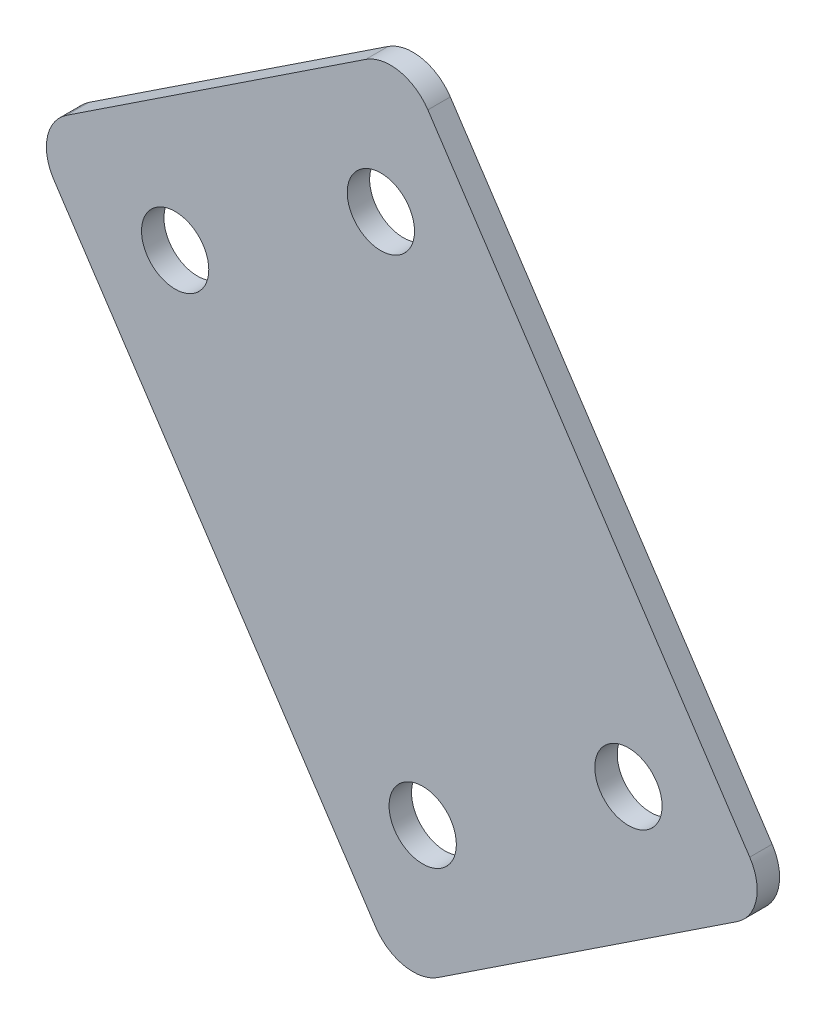
ISO-10303-21;
HEADER;
FILE_DESCRIPTION(('STEP AP214'),'2;1');
FILE_NAME('part.step','',(''),(''),'','','');
FILE_SCHEMA(('AUTOMOTIVE_DESIGN { 1 0 10303 214 1 1 1 1 }'));
ENDSEC;
DATA;
#1=APPLICATION_CONTEXT('core data for automotive mechanical design processes');
#2=APPLICATION_PROTOCOL_DEFINITION('international standard','automotive_design',2000,#1);
#3=PRODUCT_CONTEXT('',#1,'mechanical');
#4=PRODUCT('Part','Part','',(#3));
#5=PRODUCT_RELATED_PRODUCT_CATEGORY('part','',(#4));
#6=PRODUCT_DEFINITION_FORMATION('','',#4);
#7=PRODUCT_DEFINITION_CONTEXT('part definition',#1,'design');
#8=PRODUCT_DEFINITION('design','',#6,#7);
#9=PRODUCT_DEFINITION_SHAPE('','',#8);
#10=(LENGTH_UNIT() NAMED_UNIT(*) SI_UNIT(.MILLI.,.METRE.));
#11=(NAMED_UNIT(*) PLANE_ANGLE_UNIT() SI_UNIT($,.RADIAN.));
#12=(NAMED_UNIT(*) SI_UNIT($,.STERADIAN.) SOLID_ANGLE_UNIT());
#13=UNCERTAINTY_MEASURE_WITH_UNIT(LENGTH_MEASURE(1.E-05),#10,'distance_accuracy_value','');
#14=(GEOMETRIC_REPRESENTATION_CONTEXT(3) GLOBAL_UNCERTAINTY_ASSIGNED_CONTEXT((#13)) GLOBAL_UNIT_ASSIGNED_CONTEXT((#10,
#11,#12)) REPRESENTATION_CONTEXT('',''));
#15=CARTESIAN_POINT('',(0.,0.,0.));
#16=DIRECTION('',(0.,0.,1.));
#17=DIRECTION('',(1.,0.,0.));
#18=AXIS2_PLACEMENT_3D('',#15,#16,#17);
#19=CARTESIAN_POINT('',(13.8462673855963,-6.42501980437193,1.));
#20=DIRECTION('',(0.,0.,1.));
#21=DIRECTION('',(1.,0.,0.));
#22=AXIS2_PLACEMENT_3D('',#19,#20,#21);
#23=PLANE('',#22);
#24=CARTESIAN_POINT('',(-10.1057418744918,5.30320480145186,1.));
#25=DIRECTION('',(0.,0.,1.));
#26=DIRECTION('',(1.,0.,0.));
#27=AXIS2_PLACEMENT_3D('',#24,#25,#26);
#28=CIRCLE('',#27,1.50000000000001);
#29=CARTESIAN_POINT('',(-8.60574187449182,5.30320480145186,1.));
#30=VERTEX_POINT('',#29);
#31=EDGE_CURVE('E196',#30,#30,#28,.T.);
#32=ORIENTED_EDGE('',*,*,#31,.F.);
#33=EDGE_LOOP('',(#32));
#34=FACE_BOUND('',#33,.T.);
#35=CARTESIAN_POINT('',(10.1057418744918,-5.30320480145186,1.));
#36=DIRECTION('',(0.,0.,1.));
#37=DIRECTION('',(1.,0.,0.));
#38=AXIS2_PLACEMENT_3D('',#35,#36,#37);
#39=CIRCLE('',#38,1.50000000000001);
#40=CARTESIAN_POINT('',(11.6057418744918,-5.30320480145186,1.));
#41=VERTEX_POINT('',#40);
#42=EDGE_CURVE('E142',#41,#41,#39,.T.);
#43=ORIENTED_EDGE('',*,*,#42,.F.);
#44=EDGE_LOOP('',(#43));
#45=FACE_BOUND('',#44,.T.);
#46=CARTESIAN_POINT('',(13.8462673855963,-6.42501980437193,1.));
#47=DIRECTION('',(0.,0.,1.));
#48=DIRECTION('',(1.,0.,0.));
#49=AXIS2_PLACEMENT_3D('',#46,#47,#48);
#50=CIRCLE('',#49,1.99999999999999);
#51=CARTESIAN_POINT('',(14.950141356221,-8.09279144850589,1.));
#52=VERTEX_POINT('',#51);
#53=CARTESIAN_POINT('',(15.5140390297303,-5.32114583374726,1.));
#54=VERTEX_POINT('',#53);
#55=EDGE_CURVE('E153',#52,#54,#50,.T.);
#56=ORIENTED_EDGE('',*,*,#55,.T.);
#57=DIRECTION('',(-0.551936985312345,0.833885822066978,0.));
#58=VECTOR('',#57,1.);
#59=CARTESIAN_POINT('',(15.5140390297303,-5.32114583374726,1.));
#60=LINE('',#59,#58);
#61=CARTESIAN_POINT('',(1.16367741160929,16.3598855399942,1.));
#62=VERTEX_POINT('',#61);
#63=EDGE_CURVE('E101',#54,#62,#60,.T.);
#64=ORIENTED_EDGE('',*,*,#63,.T.);
#65=CARTESIAN_POINT('',(-0.504094232524663,15.2560115693695,1.));
#66=DIRECTION('',(0.,0.,1.));
#67=DIRECTION('',(1.,0.,0.));
#68=AXIS2_PLACEMENT_3D('',#65,#66,#67);
#69=CIRCLE('',#68,2.00000000000001);
#70=CARTESIAN_POINT('',(-1.60796820314935,16.9237832135034,1.));
#71=VERTEX_POINT('',#70);
#72=EDGE_CURVE('E168',#62,#71,#69,.T.);
#73=ORIENTED_EDGE('',*,*,#72,.T.);
#74=DIRECTION('',(-0.833885822066978,-0.551936985312345,0.));
#75=VECTOR('',#74,1.);
#76=CARTESIAN_POINT('',(-1.60796820314935,16.9237832135034,1.));
#77=LINE('',#76,#75);
#78=CARTESIAN_POINT('',(-14.950141356221,8.09279144850588,1.));
#79=VERTEX_POINT('',#78);
#80=EDGE_CURVE('E181',#71,#79,#77,.T.);
#81=ORIENTED_EDGE('',*,*,#80,.T.);
#82=CARTESIAN_POINT('',(-13.8462673855963,6.42501980437193,1.));
#83=DIRECTION('',(0.,0.,1.));
#84=DIRECTION('',(1.,0.,0.));
#85=AXIS2_PLACEMENT_3D('',#82,#83,#84);
#86=CIRCLE('',#85,1.99999999999999);
#87=CARTESIAN_POINT('',(-15.5140390297303,5.32114583374726,1.));
#88=VERTEX_POINT('',#87);
#89=EDGE_CURVE('E120',#79,#88,#86,.T.);
#90=ORIENTED_EDGE('',*,*,#89,.T.);
#91=DIRECTION('',(0.551936985312345,-0.833885822066978,0.));
#92=VECTOR('',#91,1.);
#93=CARTESIAN_POINT('',(-15.5140390297303,5.32114583374726,1.));
#94=LINE('',#93,#92);
#95=CARTESIAN_POINT('',(-1.16367741160929,-16.3598855399942,1.));
#96=VERTEX_POINT('',#95);
#97=EDGE_CURVE('E114',#88,#96,#94,.T.);
#98=ORIENTED_EDGE('',*,*,#97,.T.);
#99=CARTESIAN_POINT('',(0.504094232524663,-15.2560115693695,1.));
#100=DIRECTION('',(0.,0.,1.));
#101=DIRECTION('',(1.,0.,0.));
#102=AXIS2_PLACEMENT_3D('',#99,#100,#101);
#103=CIRCLE('',#102,2.00000000000001);
#104=CARTESIAN_POINT('',(1.60796820314935,-16.9237832135034,1.));
#105=VERTEX_POINT('',#104);
#106=EDGE_CURVE('E118',#96,#105,#103,.T.);
#107=ORIENTED_EDGE('',*,*,#106,.T.);
#108=DIRECTION('',(0.833885822066978,0.551936985312345,0.));
#109=VECTOR('',#108,1.);
#110=CARTESIAN_POINT('',(1.60796820314935,-16.9237832135034,1.));
#111=LINE('',#110,#109);
#112=EDGE_CURVE('E58',#105,#52,#111,.T.);
#113=ORIENTED_EDGE('',*,*,#112,.T.);
#114=EDGE_LOOP('',(#56,#64,#73,#81,#90,#98,#107,#113));
#115=FACE_BOUND('',#114,.T.);
#116=CARTESIAN_POINT('',(0.932997831755072,-11.3745116398877,1.));
#117=DIRECTION('',(0.,0.,1.));
#118=DIRECTION('',(1.,0.,0.));
#119=AXIS2_PLACEMENT_3D('',#116,#117,#118);
#120=CIRCLE('',#119,1.5);
#121=CARTESIAN_POINT('',(2.43299783175507,-11.3745116398877,1.));
#122=VERTEX_POINT('',#121);
#123=EDGE_CURVE('E190',#122,#122,#120,.T.);
#124=ORIENTED_EDGE('',*,*,#123,.F.);
#125=EDGE_LOOP('',(#124));
#126=FACE_BOUND('',#125,.T.);
#127=CARTESIAN_POINT('',(-0.932997831755072,11.3745116398877,1.));
#128=DIRECTION('',(0.,0.,1.));
#129=DIRECTION('',(1.,0.,0.));
#130=AXIS2_PLACEMENT_3D('',#127,#128,#129);
#131=CIRCLE('',#130,1.5);
#132=CARTESIAN_POINT('',(0.567002168244926,11.3745116398877,1.));
#133=VERTEX_POINT('',#132);
#134=EDGE_CURVE('E202',#133,#133,#131,.T.);
#135=ORIENTED_EDGE('',*,*,#134,.F.);
#136=EDGE_LOOP('',(#135));
#137=FACE_BOUND('',#136,.T.);
#138=ADVANCED_FACE('F41',(#34,#45,#115,#126,#137),#23,.T.);
#139=CARTESIAN_POINT('',(13.8462673855963,-6.42501980437193,0.));
#140=DIRECTION('',(0.,0.,1.));
#141=DIRECTION('',(1.,0.,0.));
#142=AXIS2_PLACEMENT_3D('',#139,#140,#141);
#143=PLANE('',#142);
#144=CARTESIAN_POINT('',(13.8462673855963,-6.42501980437193,0.));
#145=DIRECTION('',(0.,0.,1.));
#146=DIRECTION('',(1.,0.,0.));
#147=AXIS2_PLACEMENT_3D('',#144,#145,#146);
#148=CIRCLE('',#147,1.99999999999999);
#149=CARTESIAN_POINT('',(14.950141356221,-8.09279144850589,0.));
#150=VERTEX_POINT('',#149);
#151=CARTESIAN_POINT('',(15.5140390297303,-5.32114583374726,0.));
#152=VERTEX_POINT('',#151);
#153=EDGE_CURVE('E138',#150,#152,#148,.T.);
#154=ORIENTED_EDGE('',*,*,#153,.F.);
#155=DIRECTION('',(0.833885822066978,0.551936985312345,0.));
#156=VECTOR('',#155,1.);
#157=CARTESIAN_POINT('',(1.60796820314935,-16.9237832135034,0.));
#158=LINE('',#157,#156);
#159=CARTESIAN_POINT('',(1.60796820314935,-16.9237832135034,0.));
#160=VERTEX_POINT('',#159);
#161=EDGE_CURVE('E93',#160,#150,#158,.T.);
#162=ORIENTED_EDGE('',*,*,#161,.F.);
#163=CARTESIAN_POINT('',(0.504094232524663,-15.2560115693695,0.));
#164=DIRECTION('',(0.,0.,1.));
#165=DIRECTION('',(1.,0.,0.));
#166=AXIS2_PLACEMENT_3D('',#163,#164,#165);
#167=CIRCLE('',#166,2.00000000000001);
#168=CARTESIAN_POINT('',(-1.16367741160929,-16.3598855399942,0.));
#169=VERTEX_POINT('',#168);
#170=EDGE_CURVE('E87',#169,#160,#167,.T.);
#171=ORIENTED_EDGE('',*,*,#170,.F.);
#172=DIRECTION('',(0.551936985312345,-0.833885822066978,0.));
#173=VECTOR('',#172,1.);
#174=CARTESIAN_POINT('',(-15.5140390297303,5.32114583374726,0.));
#175=LINE('',#174,#173);
#176=CARTESIAN_POINT('',(-15.5140390297303,5.32114583374726,0.));
#177=VERTEX_POINT('',#176);
#178=EDGE_CURVE('E128',#177,#169,#175,.T.);
#179=ORIENTED_EDGE('',*,*,#178,.F.);
#180=CARTESIAN_POINT('',(-13.8462673855963,6.42501980437193,0.));
#181=DIRECTION('',(0.,0.,1.));
#182=DIRECTION('',(1.,0.,0.));
#183=AXIS2_PLACEMENT_3D('',#180,#181,#182);
#184=CIRCLE('',#183,1.99999999999999);
#185=CARTESIAN_POINT('',(-14.950141356221,8.09279144850588,0.));
#186=VERTEX_POINT('',#185);
#187=EDGE_CURVE('E148',#186,#177,#184,.T.);
#188=ORIENTED_EDGE('',*,*,#187,.F.);
#189=DIRECTION('',(-0.833885822066978,-0.551936985312345,0.));
#190=VECTOR('',#189,1.);
#191=CARTESIAN_POINT('',(-1.60796820314935,16.9237832135034,0.));
#192=LINE('',#191,#190);
#193=CARTESIAN_POINT('',(-1.60796820314935,16.9237832135034,0.));
#194=VERTEX_POINT('',#193);
#195=EDGE_CURVE('E146',#194,#186,#192,.T.);
#196=ORIENTED_EDGE('',*,*,#195,.F.);
#197=CARTESIAN_POINT('',(-0.504094232524663,15.2560115693695,0.));
#198=DIRECTION('',(0.,0.,1.));
#199=DIRECTION('',(1.,0.,0.));
#200=AXIS2_PLACEMENT_3D('',#197,#198,#199);
#201=CIRCLE('',#200,2.00000000000001);
#202=CARTESIAN_POINT('',(1.16367741160929,16.3598855399942,0.));
#203=VERTEX_POINT('',#202);
#204=EDGE_CURVE('E144',#203,#194,#201,.T.);
#205=ORIENTED_EDGE('',*,*,#204,.F.);
#206=DIRECTION('',(-0.551936985312345,0.833885822066978,0.));
#207=VECTOR('',#206,1.);
#208=CARTESIAN_POINT('',(15.5140390297303,-5.32114583374726,0.));
#209=LINE('',#208,#207);
#210=EDGE_CURVE('E141',#152,#203,#209,.T.);
#211=ORIENTED_EDGE('',*,*,#210,.F.);
#212=EDGE_LOOP('',(#154,#162,#171,#179,#188,#196,#205,#211));
#213=FACE_BOUND('',#212,.T.);
#214=CARTESIAN_POINT('',(10.1057418744918,-5.30320480145186,0.));
#215=DIRECTION('',(0.,0.,1.));
#216=DIRECTION('',(1.,0.,0.));
#217=AXIS2_PLACEMENT_3D('',#214,#215,#216);
#218=CIRCLE('',#217,1.50000000000001);
#219=CARTESIAN_POINT('',(11.6057418744918,-5.30320480145186,0.));
#220=VERTEX_POINT('',#219);
#221=EDGE_CURVE('E187',#220,#220,#218,.T.);
#222=ORIENTED_EDGE('',*,*,#221,.T.);
#223=EDGE_LOOP('',(#222));
#224=FACE_BOUND('',#223,.T.);
#225=CARTESIAN_POINT('',(0.932997831755072,-11.3745116398877,0.));
#226=DIRECTION('',(0.,0.,1.));
#227=DIRECTION('',(1.,0.,0.));
#228=AXIS2_PLACEMENT_3D('',#225,#226,#227);
#229=CIRCLE('',#228,1.5);
#230=CARTESIAN_POINT('',(2.43299783175507,-11.3745116398877,0.));
#231=VERTEX_POINT('',#230);
#232=EDGE_CURVE('E193',#231,#231,#229,.T.);
#233=ORIENTED_EDGE('',*,*,#232,.T.);
#234=EDGE_LOOP('',(#233));
#235=FACE_BOUND('',#234,.T.);
#236=CARTESIAN_POINT('',(-10.1057418744918,5.30320480145186,0.));
#237=DIRECTION('',(0.,0.,1.));
#238=DIRECTION('',(1.,0.,0.));
#239=AXIS2_PLACEMENT_3D('',#236,#237,#238);
#240=CIRCLE('',#239,1.50000000000001);
#241=CARTESIAN_POINT('',(-8.60574187449182,5.30320480145186,0.));
#242=VERTEX_POINT('',#241);
#243=EDGE_CURVE('E199',#242,#242,#240,.T.);
#244=ORIENTED_EDGE('',*,*,#243,.T.);
#245=EDGE_LOOP('',(#244));
#246=FACE_BOUND('',#245,.T.);
#247=CARTESIAN_POINT('',(-0.932997831755072,11.3745116398877,0.));
#248=DIRECTION('',(0.,0.,1.));
#249=DIRECTION('',(1.,0.,0.));
#250=AXIS2_PLACEMENT_3D('',#247,#248,#249);
#251=CIRCLE('',#250,1.5);
#252=CARTESIAN_POINT('',(0.567002168244926,11.3745116398877,0.));
#253=VERTEX_POINT('',#252);
#254=EDGE_CURVE('E205',#253,#253,#251,.T.);
#255=ORIENTED_EDGE('',*,*,#254,.T.);
#256=EDGE_LOOP('',(#255));
#257=FACE_BOUND('',#256,.T.);
#258=ADVANCED_FACE('F172',(#213,#224,#235,#246,#257),#143,.F.);
#259=CARTESIAN_POINT('',(13.8462673855963,-6.42501980437193,1.));
#260=DIRECTION('',(0.,0.,-1.));
#261=DIRECTION('',(-1.,0.,0.));
#262=AXIS2_PLACEMENT_3D('',#259,#260,#261);
#263=CYLINDRICAL_SURFACE('',#262,1.99999999999999);
#264=ORIENTED_EDGE('',*,*,#153,.T.);
#265=DIRECTION('',(0.,0.,-1.));
#266=VECTOR('',#265,1.);
#267=CARTESIAN_POINT('',(15.5140390297303,-5.32114583374726,1.));
#268=LINE('',#267,#266);
#269=EDGE_CURVE('E11',#54,#152,#268,.T.);
#270=ORIENTED_EDGE('',*,*,#269,.F.);
#271=ORIENTED_EDGE('',*,*,#55,.F.);
#272=DIRECTION('',(0.,0.,-1.));
#273=VECTOR('',#272,1.);
#274=CARTESIAN_POINT('',(14.950141356221,-8.09279144850589,1.));
#275=LINE('',#274,#273);
#276=EDGE_CURVE('E134',#52,#150,#275,.T.);
#277=ORIENTED_EDGE('',*,*,#276,.T.);
#278=EDGE_LOOP('',(#264,#270,#271,#277));
#279=FACE_BOUND('',#278,.T.);
#280=ADVANCED_FACE('F43',(#279),#263,.T.);
#281=CARTESIAN_POINT('',(15.5140390297303,-5.32114583374726,1.));
#282=DIRECTION('',(-0.833885822066979,-0.551936985312345,0.));
#283=DIRECTION('',(0.551936985312345,-0.833885822066978,0.));
#284=AXIS2_PLACEMENT_3D('',#281,#282,#283);
#285=PLANE('',#284);
#286=ORIENTED_EDGE('',*,*,#210,.T.);
#287=DIRECTION('',(0.,0.,-1.));
#288=VECTOR('',#287,1.);
#289=CARTESIAN_POINT('',(1.16367741160929,16.3598855399942,1.));
#290=LINE('',#289,#288);
#291=EDGE_CURVE('E50',#62,#203,#290,.T.);
#292=ORIENTED_EDGE('',*,*,#291,.F.);
#293=ORIENTED_EDGE('',*,*,#63,.F.);
#294=ORIENTED_EDGE('',*,*,#269,.T.);
#295=EDGE_LOOP('',(#286,#292,#293,#294));
#296=FACE_BOUND('',#295,.T.);
#297=ADVANCED_FACE('F238',(#296),#285,.F.);
#298=CARTESIAN_POINT('',(-0.504094232524663,15.2560115693695,1.));
#299=DIRECTION('',(0.,0.,-1.));
#300=DIRECTION('',(-1.,0.,0.));
#301=AXIS2_PLACEMENT_3D('',#298,#299,#300);
#302=CYLINDRICAL_SURFACE('',#301,2.00000000000001);
#303=ORIENTED_EDGE('',*,*,#204,.T.);
#304=DIRECTION('',(0.,0.,-1.));
#305=VECTOR('',#304,1.);
#306=CARTESIAN_POINT('',(-1.60796820314935,16.9237832135034,1.));
#307=LINE('',#306,#305);
#308=EDGE_CURVE('E160',#71,#194,#307,.T.);
#309=ORIENTED_EDGE('',*,*,#308,.F.);
#310=ORIENTED_EDGE('',*,*,#72,.F.);
#311=ORIENTED_EDGE('',*,*,#291,.T.);
#312=EDGE_LOOP('',(#303,#309,#310,#311));
#313=FACE_BOUND('',#312,.T.);
#314=ADVANCED_FACE('F166',(#313),#302,.T.);
#315=CARTESIAN_POINT('',(-1.60796820314935,16.9237832135034,1.));
#316=DIRECTION('',(0.551936985312345,-0.833885822066978,0.));
#317=DIRECTION('',(0.833885822066978,0.551936985312345,0.));
#318=AXIS2_PLACEMENT_3D('',#315,#316,#317);
#319=PLANE('',#318);
#320=ORIENTED_EDGE('',*,*,#195,.T.);
#321=DIRECTION('',(0.,0.,-1.));
#322=VECTOR('',#321,1.);
#323=CARTESIAN_POINT('',(-14.950141356221,8.09279144850588,1.));
#324=LINE('',#323,#322);
#325=EDGE_CURVE('E157',#79,#186,#324,.T.);
#326=ORIENTED_EDGE('',*,*,#325,.F.);
#327=ORIENTED_EDGE('',*,*,#80,.F.);
#328=ORIENTED_EDGE('',*,*,#308,.T.);
#329=EDGE_LOOP('',(#320,#326,#327,#328));
#330=FACE_BOUND('',#329,.T.);
#331=ADVANCED_FACE('F177',(#330),#319,.F.);
#332=CARTESIAN_POINT('',(-13.8462673855963,6.42501980437193,1.));
#333=DIRECTION('',(0.,0.,-1.));
#334=DIRECTION('',(-1.,0.,0.));
#335=AXIS2_PLACEMENT_3D('',#332,#333,#334);
#336=CYLINDRICAL_SURFACE('',#335,1.99999999999999);
#337=ORIENTED_EDGE('',*,*,#187,.T.);
#338=DIRECTION('',(0.,0.,-1.));
#339=VECTOR('',#338,1.);
#340=CARTESIAN_POINT('',(-15.5140390297303,5.32114583374726,1.));
#341=LINE('',#340,#339);
#342=EDGE_CURVE('E129',#88,#177,#341,.T.);
#343=ORIENTED_EDGE('',*,*,#342,.F.);
#344=ORIENTED_EDGE('',*,*,#89,.F.);
#345=ORIENTED_EDGE('',*,*,#325,.T.);
#346=EDGE_LOOP('',(#337,#343,#344,#345));
#347=FACE_BOUND('',#346,.T.);
#348=ADVANCED_FACE('F180',(#347),#336,.T.);
#349=CARTESIAN_POINT('',(-15.5140390297303,5.32114583374726,1.));
#350=DIRECTION('',(0.833885822066979,0.551936985312345,0.));
#351=DIRECTION('',(-0.551936985312345,0.833885822066978,0.));
#352=AXIS2_PLACEMENT_3D('',#349,#350,#351);
#353=PLANE('',#352);
#354=ORIENTED_EDGE('',*,*,#178,.T.);
#355=DIRECTION('',(0.,0.,-1.));
#356=VECTOR('',#355,1.);
#357=CARTESIAN_POINT('',(-1.16367741160929,-16.3598855399942,1.));
#358=LINE('',#357,#356);
#359=EDGE_CURVE('E125',#96,#169,#358,.T.);
#360=ORIENTED_EDGE('',*,*,#359,.F.);
#361=ORIENTED_EDGE('',*,*,#97,.F.);
#362=ORIENTED_EDGE('',*,*,#342,.T.);
#363=EDGE_LOOP('',(#354,#360,#361,#362));
#364=FACE_BOUND('',#363,.T.);
#365=ADVANCED_FACE('F126',(#364),#353,.F.);
#366=CARTESIAN_POINT('',(0.504094232524663,-15.2560115693695,1.));
#367=DIRECTION('',(0.,0.,-1.));
#368=DIRECTION('',(-1.,0.,0.));
#369=AXIS2_PLACEMENT_3D('',#366,#367,#368);
#370=CYLINDRICAL_SURFACE('',#369,2.00000000000001);
#371=ORIENTED_EDGE('',*,*,#170,.T.);
#372=DIRECTION('',(0.,0.,-1.));
#373=VECTOR('',#372,1.);
#374=CARTESIAN_POINT('',(1.60796820314935,-16.9237832135034,1.));
#375=LINE('',#374,#373);
#376=EDGE_CURVE('E130',#105,#160,#375,.T.);
#377=ORIENTED_EDGE('',*,*,#376,.F.);
#378=ORIENTED_EDGE('',*,*,#106,.F.);
#379=ORIENTED_EDGE('',*,*,#359,.T.);
#380=EDGE_LOOP('',(#371,#377,#378,#379));
#381=FACE_BOUND('',#380,.T.);
#382=ADVANCED_FACE('F132',(#381),#370,.T.);
#383=CARTESIAN_POINT('',(1.60796820314935,-16.9237832135034,1.));
#384=DIRECTION('',(-0.551936985312345,0.833885822066978,0.));
#385=DIRECTION('',(-0.833885822066978,-0.551936985312345,0.));
#386=AXIS2_PLACEMENT_3D('',#383,#384,#385);
#387=PLANE('',#386);
#388=ORIENTED_EDGE('',*,*,#161,.T.);
#389=ORIENTED_EDGE('',*,*,#276,.F.);
#390=ORIENTED_EDGE('',*,*,#112,.F.);
#391=ORIENTED_EDGE('',*,*,#376,.T.);
#392=EDGE_LOOP('',(#388,#389,#390,#391));
#393=FACE_BOUND('',#392,.T.);
#394=ADVANCED_FACE('F226',(#393),#387,.F.);
#395=CARTESIAN_POINT('',(10.1057418744918,-5.30320480145186,1.));
#396=DIRECTION('',(0.,0.,-1.));
#397=DIRECTION('',(-1.,0.,0.));
#398=AXIS2_PLACEMENT_3D('',#395,#396,#397);
#399=CYLINDRICAL_SURFACE('',#398,1.50000000000001);
#400=ORIENTED_EDGE('',*,*,#221,.F.);
#401=EDGE_LOOP('',(#400));
#402=FACE_BOUND('',#401,.T.);
#403=ORIENTED_EDGE('',*,*,#42,.T.);
#404=EDGE_LOOP('',(#403));
#405=FACE_BOUND('',#404,.T.);
#406=ADVANCED_FACE('F223',(#402,#405),#399,.F.);
#407=CARTESIAN_POINT('',(0.932997831755072,-11.3745116398877,1.));
#408=DIRECTION('',(0.,0.,-1.));
#409=DIRECTION('',(-1.,0.,0.));
#410=AXIS2_PLACEMENT_3D('',#407,#408,#409);
#411=CYLINDRICAL_SURFACE('',#410,1.5);
#412=ORIENTED_EDGE('',*,*,#232,.F.);
#413=EDGE_LOOP('',(#412));
#414=FACE_BOUND('',#413,.T.);
#415=ORIENTED_EDGE('',*,*,#123,.T.);
#416=EDGE_LOOP('',(#415));
#417=FACE_BOUND('',#416,.T.);
#418=ADVANCED_FACE('F301',(#414,#417),#411,.F.);
#419=CARTESIAN_POINT('',(-10.1057418744918,5.30320480145186,1.));
#420=DIRECTION('',(0.,0.,-1.));
#421=DIRECTION('',(-1.,0.,0.));
#422=AXIS2_PLACEMENT_3D('',#419,#420,#421);
#423=CYLINDRICAL_SURFACE('',#422,1.50000000000001);
#424=ORIENTED_EDGE('',*,*,#243,.F.);
#425=EDGE_LOOP('',(#424));
#426=FACE_BOUND('',#425,.T.);
#427=ORIENTED_EDGE('',*,*,#31,.T.);
#428=EDGE_LOOP('',(#427));
#429=FACE_BOUND('',#428,.T.);
#430=ADVANCED_FACE('F310',(#426,#429),#423,.F.);
#431=CARTESIAN_POINT('',(-0.932997831755072,11.3745116398877,1.));
#432=DIRECTION('',(0.,0.,-1.));
#433=DIRECTION('',(-1.,0.,0.));
#434=AXIS2_PLACEMENT_3D('',#431,#432,#433);
#435=CYLINDRICAL_SURFACE('',#434,1.5);
#436=ORIENTED_EDGE('',*,*,#254,.F.);
#437=EDGE_LOOP('',(#436));
#438=FACE_BOUND('',#437,.T.);
#439=ORIENTED_EDGE('',*,*,#134,.T.);
#440=EDGE_LOOP('',(#439));
#441=FACE_BOUND('',#440,.T.);
#442=ADVANCED_FACE('F211',(#438,#441),#435,.F.);
#443=CLOSED_SHELL('',(#138,#258,#280,#297,#314,#331,#348,#365,#382,#394,#406,#418,#430,#442));
#444=MANIFOLD_SOLID_BREP('B2',#443);
#445=ADVANCED_BREP_SHAPE_REPRESENTATION('',(#18,#444),#14);
#446=SHAPE_DEFINITION_REPRESENTATION(#9,#445);
ENDSEC;
END-ISO-10303-21;
